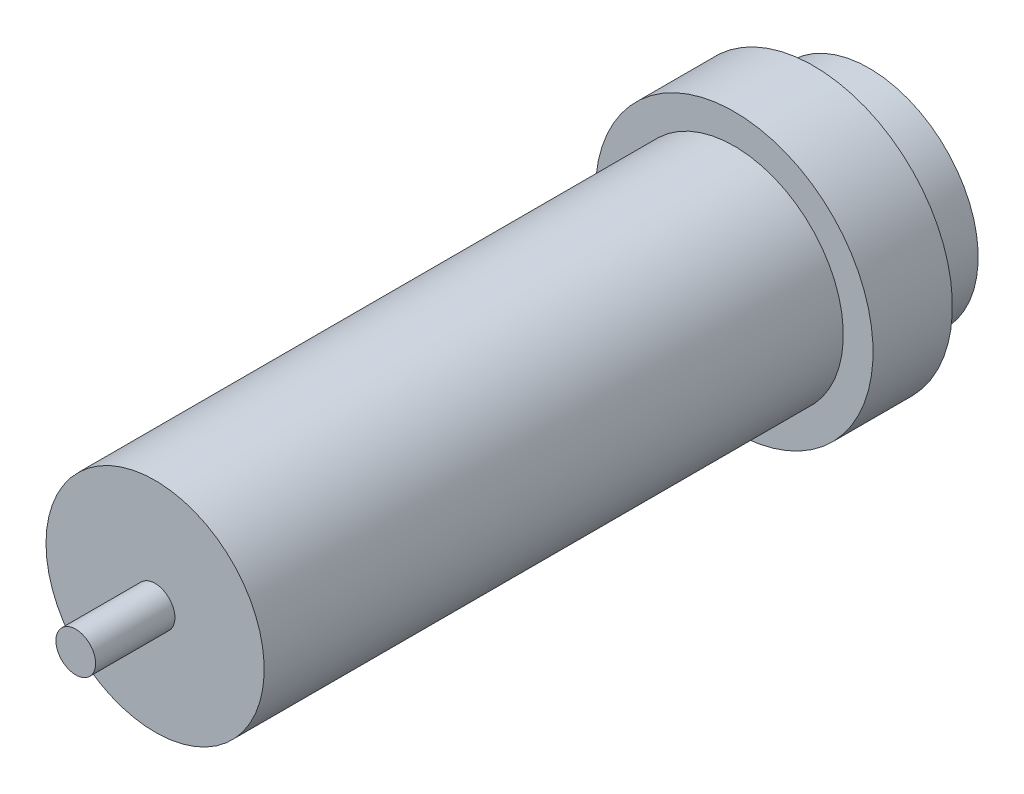
ISO-10303-21;
HEADER;
FILE_DESCRIPTION(('STEP AP214'),'2;1');
FILE_NAME('part.step','',(''),(''),'','','');
FILE_SCHEMA(('AUTOMOTIVE_DESIGN { 1 0 10303 214 1 1 1 1 }'));
ENDSEC;
DATA;
#1=APPLICATION_CONTEXT('core data for automotive mechanical design processes');
#2=APPLICATION_PROTOCOL_DEFINITION('international standard','automotive_design',2000,#1);
#3=PRODUCT_CONTEXT('',#1,'mechanical');
#4=PRODUCT('Part','Part','',(#3));
#5=PRODUCT_RELATED_PRODUCT_CATEGORY('part','',(#4));
#6=PRODUCT_DEFINITION_FORMATION('','',#4);
#7=PRODUCT_DEFINITION_CONTEXT('part definition',#1,'design');
#8=PRODUCT_DEFINITION('design','',#6,#7);
#9=PRODUCT_DEFINITION_SHAPE('','',#8);
#10=(LENGTH_UNIT() NAMED_UNIT(*) SI_UNIT(.MILLI.,.METRE.));
#11=(NAMED_UNIT(*) PLANE_ANGLE_UNIT() SI_UNIT($,.RADIAN.));
#12=(NAMED_UNIT(*) SI_UNIT($,.STERADIAN.) SOLID_ANGLE_UNIT());
#13=UNCERTAINTY_MEASURE_WITH_UNIT(LENGTH_MEASURE(1.E-05),#10,'distance_accuracy_value','');
#14=(GEOMETRIC_REPRESENTATION_CONTEXT(3) GLOBAL_UNCERTAINTY_ASSIGNED_CONTEXT((#13)) GLOBAL_UNIT_ASSIGNED_CONTEXT((#10,
#11,#12)) REPRESENTATION_CONTEXT('',''));
#15=CARTESIAN_POINT('',(0.,0.,0.));
#16=DIRECTION('',(0.,0.,1.));
#17=DIRECTION('',(1.,0.,0.));
#18=AXIS2_PLACEMENT_3D('',#15,#16,#17);
#19=CARTESIAN_POINT('',(0.,0.,10.));
#20=DIRECTION('',(0.,0.,-1.));
#21=DIRECTION('',(-1.,0.,0.));
#22=AXIS2_PLACEMENT_3D('',#19,#20,#21);
#23=CYLINDRICAL_SURFACE('',#22,5.);
#24=CARTESIAN_POINT('',(0.,0.,10.));
#25=DIRECTION('',(0.,0.,1.));
#26=DIRECTION('',(1.,0.,0.));
#27=AXIS2_PLACEMENT_3D('',#24,#25,#26);
#28=CIRCLE('',#27,5.);
#29=CARTESIAN_POINT('',(5.,0.,10.));
#30=VERTEX_POINT('',#29);
#31=EDGE_CURVE('E42',#30,#30,#28,.T.);
#32=ORIENTED_EDGE('',*,*,#31,.F.);
#33=EDGE_LOOP('',(#32));
#34=FACE_BOUND('',#33,.T.);
#35=CARTESIAN_POINT('',(0.,0.,0.));
#36=DIRECTION('',(0.,0.,1.));
#37=DIRECTION('',(1.,0.,0.));
#38=AXIS2_PLACEMENT_3D('',#35,#36,#37);
#39=CIRCLE('',#38,5.);
#40=CARTESIAN_POINT('',(5.,0.,0.));
#41=VERTEX_POINT('',#40);
#42=EDGE_CURVE('E56',#41,#41,#39,.T.);
#43=ORIENTED_EDGE('',*,*,#42,.T.);
#44=EDGE_LOOP('',(#43));
#45=FACE_BOUND('',#44,.T.);
#46=ADVANCED_FACE('F31',(#34,#45),#23,.T.);
#47=CARTESIAN_POINT('',(0.,0.,0.));
#48=DIRECTION('',(0.,0.,1.));
#49=DIRECTION('',(1.,0.,0.));
#50=AXIS2_PLACEMENT_3D('',#47,#48,#49);
#51=PLANE('',#50);
#52=ORIENTED_EDGE('',*,*,#42,.F.);
#53=EDGE_LOOP('',(#52));
#54=FACE_BOUND('',#53,.T.);
#55=ADVANCED_FACE('F92',(#54),#51,.F.);
#56=CARTESIAN_POINT('',(0.,0.,190.));
#57=DIRECTION('',(0.,0.,-1.));
#58=DIRECTION('',(-1.,0.,0.));
#59=AXIS2_PLACEMENT_3D('',#56,#57,#58);
#60=CYLINDRICAL_SURFACE('',#59,27.5);
#61=CARTESIAN_POINT('',(0.,0.,24.));
#62=DIRECTION('',(0.,0.,-1.));
#63=DIRECTION('',(-1.,0.,0.));
#64=AXIS2_PLACEMENT_3D('',#61,#62,#63);
#65=CIRCLE('',#64,27.5);
#66=CARTESIAN_POINT('',(-27.5,0.,24.));
#67=VERTEX_POINT('',#66);
#68=EDGE_CURVE('E52',#67,#67,#65,.T.);
#69=CARTESIAN_POINT('',(0.,0.,10.));
#70=DIRECTION('',(0.,0.,1.));
#71=DIRECTION('',(1.,0.,0.));
#72=AXIS2_PLACEMENT_3D('',#69,#70,#71);
#73=CIRCLE('',#72,27.5);
#74=CARTESIAN_POINT('',(-27.5,0.,9.99999999999998));
#75=VERTEX_POINT('',#74);
#76=EDGE_CURVE('E57',#75,#75,#73,.T.);
#77=CARTESIAN_POINT('',(-27.5,0.,24.));
#78=CARTESIAN_POINT('',(-27.5,0.,23.8541666666667));
#79=CARTESIAN_POINT('',(-27.5,0.,23.7083333333333));
#80=CARTESIAN_POINT('',(-27.5,0.,23.4166666666667));
#81=CARTESIAN_POINT('',(-27.5,0.,23.2708333333333));
#82=CARTESIAN_POINT('',(-27.5,0.,22.9791666666667));
#83=CARTESIAN_POINT('',(-27.5,0.,22.8333333333333));
#84=CARTESIAN_POINT('',(-27.5,0.,22.5416666666667));
#85=CARTESIAN_POINT('',(-27.5,0.,22.3958333333333));
#86=CARTESIAN_POINT('',(-27.5,0.,22.1041666666667));
#87=CARTESIAN_POINT('',(-27.5,0.,21.9583333333333));
#88=CARTESIAN_POINT('',(-27.5,0.,21.6666666666667));
#89=CARTESIAN_POINT('',(-27.5,0.,21.5208333333333));
#90=CARTESIAN_POINT('',(-27.5,0.,21.2291666666667));
#91=CARTESIAN_POINT('',(-27.5,0.,21.0833333333333));
#92=CARTESIAN_POINT('',(-27.5,0.,20.7916666666667));
#93=CARTESIAN_POINT('',(-27.5,0.,20.6458333333333));
#94=CARTESIAN_POINT('',(-27.5,0.,20.3541666666667));
#95=CARTESIAN_POINT('',(-27.5,0.,20.2083333333333));
#96=CARTESIAN_POINT('',(-27.5,0.,19.9166666666667));
#97=CARTESIAN_POINT('',(-27.5,0.,19.7708333333333));
#98=CARTESIAN_POINT('',(-27.5,0.,19.4791666666666));
#99=CARTESIAN_POINT('',(-27.5,0.,19.3333333333333));
#100=CARTESIAN_POINT('',(-27.5,0.,19.0416666666667));
#101=CARTESIAN_POINT('',(-27.5,0.,18.8958333333333));
#102=CARTESIAN_POINT('',(-27.5,0.,18.6041666666667));
#103=CARTESIAN_POINT('',(-27.5,0.,18.4583333333333));
#104=CARTESIAN_POINT('',(-27.5,0.,18.1666666666667));
#105=CARTESIAN_POINT('',(-27.5,0.,18.0208333333333));
#106=CARTESIAN_POINT('',(-27.5,0.,17.7291666666667));
#107=CARTESIAN_POINT('',(-27.5,0.,17.5833333333333));
#108=CARTESIAN_POINT('',(-27.5,0.,17.2916666666667));
#109=CARTESIAN_POINT('',(-27.5,0.,17.1458333333333));
#110=CARTESIAN_POINT('',(-27.5,0.,16.8541666666667));
#111=CARTESIAN_POINT('',(-27.5,0.,16.7083333333333));
#112=CARTESIAN_POINT('',(-27.5,0.,16.4166666666666));
#113=CARTESIAN_POINT('',(-27.5,0.,16.2708333333333));
#114=CARTESIAN_POINT('',(-27.5,0.,15.9791666666666));
#115=CARTESIAN_POINT('',(-27.5,0.,15.8333333333333));
#116=CARTESIAN_POINT('',(-27.5,0.,15.5416666666667));
#117=CARTESIAN_POINT('',(-27.5,0.,15.3958333333333));
#118=CARTESIAN_POINT('',(-27.5,0.,15.1041666666667));
#119=CARTESIAN_POINT('',(-27.5,0.,14.9583333333333));
#120=CARTESIAN_POINT('',(-27.5,0.,14.6666666666667));
#121=CARTESIAN_POINT('',(-27.5,0.,14.5208333333333));
#122=CARTESIAN_POINT('',(-27.5,0.,14.2291666666667));
#123=CARTESIAN_POINT('',(-27.5,0.,14.0833333333333));
#124=CARTESIAN_POINT('',(-27.5,0.,13.7916666666667));
#125=CARTESIAN_POINT('',(-27.5,0.,13.6458333333333));
#126=CARTESIAN_POINT('',(-27.5,0.,13.3541666666666));
#127=CARTESIAN_POINT('',(-27.5,0.,13.2083333333333));
#128=CARTESIAN_POINT('',(-27.5,0.,12.9166666666666));
#129=CARTESIAN_POINT('',(-27.5,0.,12.7708333333333));
#130=CARTESIAN_POINT('',(-27.5,0.,12.4791666666666));
#131=CARTESIAN_POINT('',(-27.5,0.,12.3333333333333));
#132=CARTESIAN_POINT('',(-27.5,0.,12.0416666666667));
#133=CARTESIAN_POINT('',(-27.5,0.,11.8958333333333));
#134=CARTESIAN_POINT('',(-27.5,0.,11.6041666666666));
#135=CARTESIAN_POINT('',(-27.5,0.,11.4583333333333));
#136=CARTESIAN_POINT('',(-27.5,0.,11.1666666666667));
#137=CARTESIAN_POINT('',(-27.5,0.,11.0208333333333));
#138=CARTESIAN_POINT('',(-27.5,0.,10.7291666666667));
#139=CARTESIAN_POINT('',(-27.5,0.,10.5833333333333));
#140=CARTESIAN_POINT('',(-27.5,0.,10.2916666666667));
#141=CARTESIAN_POINT('',(-27.5,0.,10.1458333333333));
#142=CARTESIAN_POINT('',(-27.5,0.,9.99999999999998));
#143=B_SPLINE_CURVE_WITH_KNOTS('',3,(#77,#78,#79,#80,#81,#82,#83,#84,#85,#86,#87,#88,#89,#90,
#91,#92,#93,#94,#95,#96,#97,#98,#99,#100,#101,#102,#103,#104,#105,#106,#107,#108,#109,#110,#111,
#112,#113,#114,#115,#116,#117,#118,#119,#120,#121,#122,#123,#124,#125,#126,#127,#128,#129,#130,
#131,#132,#133,#134,#135,#136,#137,#138,#139,#140,#141,#142),.UNSPECIFIED.,.F.,.F.,(4,2,2,2,2,2,
2,2,2,2,2,2,2,2,2,2,2,2,2,2,2,2,2,2,2,2,2,2,2,2,2,2,4),(0.,0.437500000000007,0.875000000000015,
1.31249999999999,1.75,2.18750000000001,2.62499999999999,3.0625,3.5,3.93750000000001,
4.37500000000002,4.8125,5.25,5.68750000000001,6.12499999999999,6.5625,7.00000000000001,
7.43750000000001,7.87500000000002,8.3125,8.75000000000001,9.18750000000001,9.62499999999999,
10.0625,10.5,10.9375,11.375,11.8125,12.25,12.6875,13.125,13.5625,14.),.UNSPECIFIED.);
#144=EDGE_CURVE('BSEAM66',#67,#75,#143,.T.);
#145=ORIENTED_EDGE('',*,*,#68,.T.);
#146=ORIENTED_EDGE('',*,*,#76,.T.);
#147=ORIENTED_EDGE('',*,*,#144,.T.);
#148=ORIENTED_EDGE('',*,*,#144,.F.);
#149=EDGE_LOOP('',(#145,#147,#146,#148));
#150=FACE_BOUND('',#149,.T.);
#151=ADVANCED_FACE('F66',(#150),#60,.T.);
#152=CARTESIAN_POINT('',(0.,0.,10.));
#153=DIRECTION('',(0.,0.,1.));
#154=DIRECTION('',(1.,0.,0.));
#155=AXIS2_PLACEMENT_3D('',#152,#153,#154);
#156=PLANE('',#155);
#157=ORIENTED_EDGE('',*,*,#31,.T.);
#158=EDGE_LOOP('',(#157));
#159=FACE_BOUND('',#158,.T.);
#160=ORIENTED_EDGE('',*,*,#76,.F.);
#161=EDGE_LOOP('',(#160));
#162=FACE_BOUND('',#161,.T.);
#163=ADVANCED_FACE('F79',(#159,#162),#156,.F.);
#164=CARTESIAN_POINT('',(0.,0.,44.));
#165=DIRECTION('',(0.,0.,-1.));
#166=DIRECTION('',(-1.,0.,0.));
#167=AXIS2_PLACEMENT_3D('',#164,#165,#166);
#168=CYLINDRICAL_SURFACE('',#167,35.);
#169=CARTESIAN_POINT('',(0.,0.,44.));
#170=DIRECTION('',(0.,0.,-1.));
#171=DIRECTION('',(-1.,0.,0.));
#172=AXIS2_PLACEMENT_3D('',#169,#170,#171);
#173=CIRCLE('',#172,35.);
#174=CARTESIAN_POINT('',(-35.,0.,44.));
#175=VERTEX_POINT('',#174);
#176=EDGE_CURVE('E49',#175,#175,#173,.T.);
#177=ORIENTED_EDGE('',*,*,#176,.T.);
#178=EDGE_LOOP('',(#177));
#179=FACE_BOUND('',#178,.T.);
#180=CARTESIAN_POINT('',(0.,0.,24.));
#181=DIRECTION('',(0.,0.,-1.));
#182=DIRECTION('',(-1.,0.,0.));
#183=AXIS2_PLACEMENT_3D('',#180,#181,#182);
#184=CIRCLE('',#183,35.);
#185=CARTESIAN_POINT('',(-35.,0.,24.));
#186=VERTEX_POINT('',#185);
#187=EDGE_CURVE('E46',#186,#186,#184,.T.);
#188=ORIENTED_EDGE('',*,*,#187,.F.);
#189=EDGE_LOOP('',(#188));
#190=FACE_BOUND('',#189,.T.);
#191=ADVANCED_FACE('F77',(#179,#190),#168,.T.);
#192=CARTESIAN_POINT('',(0.,0.,44.));
#193=DIRECTION('',(0.,0.,-1.));
#194=DIRECTION('',(-1.,0.,0.));
#195=AXIS2_PLACEMENT_3D('',#192,#193,#194);
#196=PLANE('',#195);
#197=CARTESIAN_POINT('',(0.,0.,44.));
#198=DIRECTION('',(0.,0.,-1.));
#199=DIRECTION('',(-1.,0.,0.));
#200=AXIS2_PLACEMENT_3D('',#197,#198,#199);
#201=CIRCLE('',#200,27.5);
#202=CARTESIAN_POINT('',(-27.5,0.,44.));
#203=VERTEX_POINT('',#202);
#204=EDGE_CURVE('E34',#203,#203,#201,.T.);
#205=ORIENTED_EDGE('',*,*,#204,.T.);
#206=EDGE_LOOP('',(#205));
#207=FACE_BOUND('',#206,.T.);
#208=ORIENTED_EDGE('',*,*,#176,.F.);
#209=EDGE_LOOP('',(#208));
#210=FACE_BOUND('',#209,.T.);
#211=ADVANCED_FACE('F73',(#207,#210),#196,.F.);
#212=CARTESIAN_POINT('',(0.,0.,24.));
#213=DIRECTION('',(0.,0.,-1.));
#214=DIRECTION('',(-1.,0.,0.));
#215=AXIS2_PLACEMENT_3D('',#212,#213,#214);
#216=PLANE('',#215);
#217=ORIENTED_EDGE('',*,*,#68,.F.);
#218=EDGE_LOOP('',(#217));
#219=FACE_BOUND('',#218,.T.);
#220=ORIENTED_EDGE('',*,*,#187,.T.);
#221=EDGE_LOOP('',(#220));
#222=FACE_BOUND('',#221,.T.);
#223=ADVANCED_FACE('F69',(#219,#222),#216,.T.);
#224=CARTESIAN_POINT('',(0.,0.,190.));
#225=DIRECTION('',(0.,0.,1.));
#226=DIRECTION('',(1.,0.,0.));
#227=AXIS2_PLACEMENT_3D('',#224,#225,#226);
#228=PLANE('',#227);
#229=CARTESIAN_POINT('',(0.,0.,190.));
#230=DIRECTION('',(0.,0.,1.));
#231=DIRECTION('',(1.,0.,0.));
#232=AXIS2_PLACEMENT_3D('',#229,#230,#231);
#233=CIRCLE('',#232,5.);
#234=CARTESIAN_POINT('',(5.,0.,190.));
#235=VERTEX_POINT('',#234);
#236=EDGE_CURVE('E10',#235,#235,#233,.T.);
#237=ORIENTED_EDGE('',*,*,#236,.F.);
#238=EDGE_LOOP('',(#237));
#239=FACE_BOUND('',#238,.T.);
#240=CARTESIAN_POINT('',(0.,0.,190.));
#241=DIRECTION('',(0.,0.,1.));
#242=DIRECTION('',(1.,0.,0.));
#243=AXIS2_PLACEMENT_3D('',#240,#241,#242);
#244=CIRCLE('',#243,27.5);
#245=CARTESIAN_POINT('',(-27.5,0.,190.));
#246=VERTEX_POINT('',#245);
#247=EDGE_CURVE('E53',#246,#246,#244,.T.);
#248=ORIENTED_EDGE('',*,*,#247,.T.);
#249=EDGE_LOOP('',(#248));
#250=FACE_BOUND('',#249,.T.);
#251=ADVANCED_FACE('F72',(#239,#250),#228,.T.);
#252=CARTESIAN_POINT('',(-27.5,0.,190.));
#253=CARTESIAN_POINT('',(-27.5,0.,188.479166666667));
#254=CARTESIAN_POINT('',(-27.5,0.,186.958333333333));
#255=CARTESIAN_POINT('',(-27.5,0.,183.916666666667));
#256=CARTESIAN_POINT('',(-27.5,0.,182.395833333333));
#257=CARTESIAN_POINT('',(-27.5,0.,179.354166666667));
#258=CARTESIAN_POINT('',(-27.5,0.,177.833333333333));
#259=CARTESIAN_POINT('',(-27.5,0.,174.791666666667));
#260=CARTESIAN_POINT('',(-27.5,0.,173.270833333333));
#261=CARTESIAN_POINT('',(-27.5,0.,170.229166666667));
#262=CARTESIAN_POINT('',(-27.5,0.,168.708333333333));
#263=CARTESIAN_POINT('',(-27.5,0.,165.666666666667));
#264=CARTESIAN_POINT('',(-27.5,0.,164.145833333333));
#265=CARTESIAN_POINT('',(-27.5,0.,161.104166666667));
#266=CARTESIAN_POINT('',(-27.5,0.,159.583333333333));
#267=CARTESIAN_POINT('',(-27.5,0.,156.541666666667));
#268=CARTESIAN_POINT('',(-27.5,0.,155.020833333333));
#269=CARTESIAN_POINT('',(-27.5,0.,151.979166666667));
#270=CARTESIAN_POINT('',(-27.5,0.,150.458333333333));
#271=CARTESIAN_POINT('',(-27.5,0.,147.416666666667));
#272=CARTESIAN_POINT('',(-27.5,0.,145.895833333333));
#273=CARTESIAN_POINT('',(-27.5,0.,142.854166666667));
#274=CARTESIAN_POINT('',(-27.5,0.,141.333333333333));
#275=CARTESIAN_POINT('',(-27.5,0.,138.291666666667));
#276=CARTESIAN_POINT('',(-27.5,0.,136.770833333333));
#277=CARTESIAN_POINT('',(-27.5,0.,133.729166666667));
#278=CARTESIAN_POINT('',(-27.5,0.,132.208333333333));
#279=CARTESIAN_POINT('',(-27.5,0.,129.166666666667));
#280=CARTESIAN_POINT('',(-27.5,0.,127.645833333333));
#281=CARTESIAN_POINT('',(-27.5,0.,124.604166666667));
#282=CARTESIAN_POINT('',(-27.5,0.,123.083333333333));
#283=CARTESIAN_POINT('',(-27.5,0.,120.041666666667));
#284=CARTESIAN_POINT('',(-27.5,0.,118.520833333333));
#285=CARTESIAN_POINT('',(-27.5,0.,115.479166666667));
#286=CARTESIAN_POINT('',(-27.5,0.,113.958333333333));
#287=CARTESIAN_POINT('',(-27.5,0.,110.916666666667));
#288=CARTESIAN_POINT('',(-27.5,0.,109.395833333333));
#289=CARTESIAN_POINT('',(-27.5,0.,106.354166666667));
#290=CARTESIAN_POINT('',(-27.5,0.,104.833333333333));
#291=CARTESIAN_POINT('',(-27.5,0.,101.791666666667));
#292=CARTESIAN_POINT('',(-27.5,0.,100.270833333333));
#293=CARTESIAN_POINT('',(-27.5,0.,97.2291666666667));
#294=CARTESIAN_POINT('',(-27.5,0.,95.7083333333333));
#295=CARTESIAN_POINT('',(-27.5,0.,92.6666666666667));
#296=CARTESIAN_POINT('',(-27.5,0.,91.1458333333333));
#297=CARTESIAN_POINT('',(-27.5,0.,88.1041666666667));
#298=CARTESIAN_POINT('',(-27.5,0.,86.5833333333333));
#299=CARTESIAN_POINT('',(-27.5,0.,83.5416666666667));
#300=CARTESIAN_POINT('',(-27.5,0.,82.0208333333333));
#301=CARTESIAN_POINT('',(-27.5,0.,78.9791666666667));
#302=CARTESIAN_POINT('',(-27.5,0.,77.4583333333333));
#303=CARTESIAN_POINT('',(-27.5,0.,74.4166666666667));
#304=CARTESIAN_POINT('',(-27.5,0.,72.8958333333333));
#305=CARTESIAN_POINT('',(-27.5,0.,69.8541666666667));
#306=CARTESIAN_POINT('',(-27.5,0.,68.3333333333333));
#307=CARTESIAN_POINT('',(-27.5,0.,65.2916666666667));
#308=CARTESIAN_POINT('',(-27.5,0.,63.7708333333333));
#309=CARTESIAN_POINT('',(-27.5,0.,60.7291666666667));
#310=CARTESIAN_POINT('',(-27.5,0.,59.2083333333333));
#311=CARTESIAN_POINT('',(-27.5,0.,56.1666666666667));
#312=CARTESIAN_POINT('',(-27.5,0.,54.6458333333333));
#313=CARTESIAN_POINT('',(-27.5,0.,51.6041666666667));
#314=CARTESIAN_POINT('',(-27.5,0.,50.0833333333333));
#315=CARTESIAN_POINT('',(-27.5,0.,47.0416666666667));
#316=CARTESIAN_POINT('',(-27.5,0.,45.5208333333333));
#317=CARTESIAN_POINT('',(-27.5,0.,44.));
#318=B_SPLINE_CURVE_WITH_KNOTS('',3,(#252,#253,#254,#255,#256,#257,#258,#259,#260,#261,#262,
#263,#264,#265,#266,#267,#268,#269,#270,#271,#272,#273,#274,#275,#276,#277,#278,#279,#280,#281,
#282,#283,#284,#285,#286,#287,#288,#289,#290,#291,#292,#293,#294,#295,#296,#297,#298,#299,#300,
#301,#302,#303,#304,#305,#306,#307,#308,#309,#310,#311,#312,#313,#314,#315,#316,#317),
.UNSPECIFIED.,.F.,.F.,(4,2,2,2,2,2,2,2,2,2,2,2,2,2,2,2,2,2,2,2,2,2,2,2,2,2,2,2,2,2,2,2,4),(0.,
4.56250000000002,9.12500000000002,13.6875,18.25,22.8125,27.375,31.9375,36.5,41.0625,45.625,
50.1875,54.75,59.3125,63.875,68.4375,73.,77.5625,82.125,86.6875,91.25,95.8125,100.375,104.9375,
109.5,114.0625,118.625,123.1875,127.75,132.3125,136.875,141.4375,146.),.UNSPECIFIED.);
#319=EDGE_CURVE('BSEAM105',#246,#203,#318,.T.);
#320=ORIENTED_EDGE('',*,*,#247,.F.);
#321=ORIENTED_EDGE('',*,*,#204,.F.);
#322=ORIENTED_EDGE('',*,*,#319,.T.);
#323=ORIENTED_EDGE('',*,*,#319,.F.);
#324=EDGE_LOOP('',(#320,#322,#321,#323));
#325=FACE_BOUND('',#324,.T.);
#326=ADVANCED_FACE('F105',(#325),#60,.T.);
#327=CARTESIAN_POINT('',(0.,0.,210.));
#328=DIRECTION('',(0.,0.,-1.));
#329=DIRECTION('',(-1.,0.,0.));
#330=AXIS2_PLACEMENT_3D('',#327,#328,#329);
#331=CYLINDRICAL_SURFACE('',#330,5.);
#332=CARTESIAN_POINT('',(0.,0.,210.));
#333=DIRECTION('',(0.,0.,1.));
#334=DIRECTION('',(1.,0.,0.));
#335=AXIS2_PLACEMENT_3D('',#332,#333,#334);
#336=CIRCLE('',#335,5.);
#337=CARTESIAN_POINT('',(5.,0.,210.));
#338=VERTEX_POINT('',#337);
#339=EDGE_CURVE('E45',#338,#338,#336,.T.);
#340=ORIENTED_EDGE('',*,*,#339,.F.);
#341=EDGE_LOOP('',(#340));
#342=FACE_BOUND('',#341,.T.);
#343=ORIENTED_EDGE('',*,*,#236,.T.);
#344=EDGE_LOOP('',(#343));
#345=FACE_BOUND('',#344,.T.);
#346=ADVANCED_FACE('F109',(#342,#345),#331,.T.);
#347=CARTESIAN_POINT('',(0.,0.,210.));
#348=DIRECTION('',(0.,0.,1.));
#349=DIRECTION('',(1.,0.,0.));
#350=AXIS2_PLACEMENT_3D('',#347,#348,#349);
#351=PLANE('',#350);
#352=ORIENTED_EDGE('',*,*,#339,.T.);
#353=EDGE_LOOP('',(#352));
#354=FACE_BOUND('',#353,.T.);
#355=ADVANCED_FACE('F115',(#354),#351,.T.);
#356=CLOSED_SHELL('',(#46,#55,#151,#163,#191,#211,#223,#251,#326,#346,#355));
#357=MANIFOLD_SOLID_BREP('B2',#356);
#358=ADVANCED_BREP_SHAPE_REPRESENTATION('',(#18,#357),#14);
#359=SHAPE_DEFINITION_REPRESENTATION(#9,#358);
ENDSEC;
END-ISO-10303-21;
